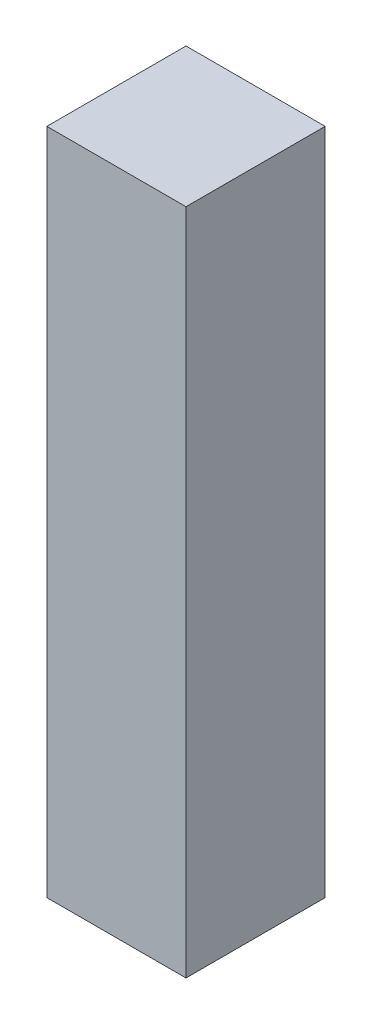
ISO-10303-21;
HEADER;
FILE_DESCRIPTION(('STEP AP214'),'2;1');
FILE_NAME('part.step','',(''),(''),'','','');
FILE_SCHEMA(('AUTOMOTIVE_DESIGN { 1 0 10303 214 1 1 1 1 }'));
ENDSEC;
DATA;
#1=APPLICATION_CONTEXT('core data for automotive mechanical design processes');
#2=APPLICATION_PROTOCOL_DEFINITION('international standard','automotive_design',2000,#1);
#3=PRODUCT_CONTEXT('',#1,'mechanical');
#4=PRODUCT('Part','Part','',(#3));
#5=PRODUCT_RELATED_PRODUCT_CATEGORY('part','',(#4));
#6=PRODUCT_DEFINITION_FORMATION('','',#4);
#7=PRODUCT_DEFINITION_CONTEXT('part definition',#1,'design');
#8=PRODUCT_DEFINITION('design','',#6,#7);
#9=PRODUCT_DEFINITION_SHAPE('','',#8);
#10=(LENGTH_UNIT() NAMED_UNIT(*) SI_UNIT(.MILLI.,.METRE.));
#11=(NAMED_UNIT(*) PLANE_ANGLE_UNIT() SI_UNIT($,.RADIAN.));
#12=(NAMED_UNIT(*) SI_UNIT($,.STERADIAN.) SOLID_ANGLE_UNIT());
#13=UNCERTAINTY_MEASURE_WITH_UNIT(LENGTH_MEASURE(1.E-05),#10,'distance_accuracy_value','');
#14=(GEOMETRIC_REPRESENTATION_CONTEXT(3) GLOBAL_UNCERTAINTY_ASSIGNED_CONTEXT((#13)) GLOBAL_UNIT_ASSIGNED_CONTEXT((#10,
#11,#12)) REPRESENTATION_CONTEXT('',''));
#15=CARTESIAN_POINT('',(0.,0.,0.));
#16=DIRECTION('',(0.,0.,1.));
#17=DIRECTION('',(1.,0.,0.));
#18=AXIS2_PLACEMENT_3D('',#15,#16,#17);
#19=CARTESIAN_POINT('',(330.,508.,-420.));
#20=DIRECTION('',(-1.,0.,0.));
#21=DIRECTION('',(0.,0.,1.));
#22=AXIS2_PLACEMENT_3D('',#19,#20,#21);
#23=PLANE('',#22);
#24=DIRECTION('',(0.,-1.,0.));
#25=VECTOR('',#24,1.);
#26=CARTESIAN_POINT('',(330.,508.,-380.));
#27=LINE('',#26,#25);
#28=CARTESIAN_POINT('',(330.,700.,-380.));
#29=VERTEX_POINT('',#28);
#30=CARTESIAN_POINT('',(330.,508.,-380.));
#31=VERTEX_POINT('',#30);
#32=EDGE_CURVE('E103',#29,#31,#27,.T.);
#33=ORIENTED_EDGE('',*,*,#32,.F.);
#34=DIRECTION('',(0.,0.,1.));
#35=VECTOR('',#34,1.);
#36=CARTESIAN_POINT('',(330.,700.,-420.));
#37=LINE('',#36,#35);
#38=CARTESIAN_POINT('',(330.,700.,-420.));
#39=VERTEX_POINT('',#38);
#40=EDGE_CURVE('E11',#39,#29,#37,.T.);
#41=ORIENTED_EDGE('',*,*,#40,.F.);
#42=DIRECTION('',(0.,-1.,0.));
#43=VECTOR('',#42,1.);
#44=CARTESIAN_POINT('',(330.,508.,-420.));
#45=LINE('',#44,#43);
#46=CARTESIAN_POINT('',(330.,508.,-420.));
#47=VERTEX_POINT('',#46);
#48=EDGE_CURVE('E97',#39,#47,#45,.T.);
#49=ORIENTED_EDGE('',*,*,#48,.T.);
#50=DIRECTION('',(0.,0.,1.));
#51=VECTOR('',#50,1.);
#52=CARTESIAN_POINT('',(330.,508.,-420.));
#53=LINE('',#52,#51);
#54=EDGE_CURVE('E42',#47,#31,#53,.T.);
#55=ORIENTED_EDGE('',*,*,#54,.T.);
#56=EDGE_LOOP('',(#33,#41,#49,#55));
#57=FACE_BOUND('',#56,.T.);
#58=ADVANCED_FACE('F39',(#57),#23,.T.);
#59=CARTESIAN_POINT('',(330.,700.,-420.));
#60=DIRECTION('',(0.,1.,0.));
#61=DIRECTION('',(0.,0.,1.));
#62=AXIS2_PLACEMENT_3D('',#59,#60,#61);
#63=PLANE('',#62);
#64=DIRECTION('',(-1.,0.,0.));
#65=VECTOR('',#64,1.);
#66=CARTESIAN_POINT('',(330.,700.,-380.));
#67=LINE('',#66,#65);
#68=CARTESIAN_POINT('',(370.,700.,-380.));
#69=VERTEX_POINT('',#68);
#70=EDGE_CURVE('E99',#69,#29,#67,.T.);
#71=ORIENTED_EDGE('',*,*,#70,.F.);
#72=DIRECTION('',(0.,0.,1.));
#73=VECTOR('',#72,1.);
#74=CARTESIAN_POINT('',(370.,700.,-420.));
#75=LINE('',#74,#73);
#76=CARTESIAN_POINT('',(370.,700.,-420.));
#77=VERTEX_POINT('',#76);
#78=EDGE_CURVE('E48',#77,#69,#75,.T.);
#79=ORIENTED_EDGE('',*,*,#78,.F.);
#80=DIRECTION('',(-1.,0.,0.));
#81=VECTOR('',#80,1.);
#82=CARTESIAN_POINT('',(330.,700.,-420.));
#83=LINE('',#82,#81);
#84=EDGE_CURVE('E94',#77,#39,#83,.T.);
#85=ORIENTED_EDGE('',*,*,#84,.T.);
#86=ORIENTED_EDGE('',*,*,#40,.T.);
#87=EDGE_LOOP('',(#71,#79,#85,#86));
#88=FACE_BOUND('',#87,.T.);
#89=ADVANCED_FACE('F113',(#88),#63,.T.);
#90=CARTESIAN_POINT('',(370.,508.,-420.));
#91=DIRECTION('',(1.,0.,0.));
#92=DIRECTION('',(0.,0.,-1.));
#93=AXIS2_PLACEMENT_3D('',#90,#91,#92);
#94=PLANE('',#93);
#95=DIRECTION('',(0.,1.,0.));
#96=VECTOR('',#95,1.);
#97=CARTESIAN_POINT('',(370.,508.,-380.));
#98=LINE('',#97,#96);
#99=CARTESIAN_POINT('',(370.,508.,-380.));
#100=VERTEX_POINT('',#99);
#101=EDGE_CURVE('E89',#100,#69,#98,.T.);
#102=ORIENTED_EDGE('',*,*,#101,.F.);
#103=DIRECTION('',(0.,0.,1.));
#104=VECTOR('',#103,1.);
#105=CARTESIAN_POINT('',(370.,508.,-420.));
#106=LINE('',#105,#104);
#107=CARTESIAN_POINT('',(370.,508.,-420.));
#108=VERTEX_POINT('',#107);
#109=EDGE_CURVE('E84',#108,#100,#106,.T.);
#110=ORIENTED_EDGE('',*,*,#109,.F.);
#111=DIRECTION('',(0.,1.,0.));
#112=VECTOR('',#111,1.);
#113=CARTESIAN_POINT('',(370.,508.,-420.));
#114=LINE('',#113,#112);
#115=EDGE_CURVE('E87',#108,#77,#114,.T.);
#116=ORIENTED_EDGE('',*,*,#115,.T.);
#117=ORIENTED_EDGE('',*,*,#78,.T.);
#118=EDGE_LOOP('',(#102,#110,#116,#117));
#119=FACE_BOUND('',#118,.T.);
#120=ADVANCED_FACE('F86',(#119),#94,.T.);
#121=CARTESIAN_POINT('',(330.,508.,-420.));
#122=DIRECTION('',(0.,-1.,0.));
#123=DIRECTION('',(0.,0.,-1.));
#124=AXIS2_PLACEMENT_3D('',#121,#122,#123);
#125=PLANE('',#124);
#126=DIRECTION('',(1.,0.,0.));
#127=VECTOR('',#126,1.);
#128=CARTESIAN_POINT('',(330.,508.,-380.));
#129=LINE('',#128,#127);
#130=EDGE_CURVE('E106',#31,#100,#129,.T.);
#131=ORIENTED_EDGE('',*,*,#130,.F.);
#132=ORIENTED_EDGE('',*,*,#54,.F.);
#133=DIRECTION('',(1.,0.,0.));
#134=VECTOR('',#133,1.);
#135=CARTESIAN_POINT('',(330.,508.,-420.));
#136=LINE('',#135,#134);
#137=EDGE_CURVE('E93',#47,#108,#136,.T.);
#138=ORIENTED_EDGE('',*,*,#137,.T.);
#139=ORIENTED_EDGE('',*,*,#109,.T.);
#140=EDGE_LOOP('',(#131,#132,#138,#139));
#141=FACE_BOUND('',#140,.T.);
#142=ADVANCED_FACE('F96',(#141),#125,.T.);
#143=CARTESIAN_POINT('',(0.,0.,-420.));
#144=DIRECTION('',(0.,0.,-1.));
#145=DIRECTION('',(-1.,0.,0.));
#146=AXIS2_PLACEMENT_3D('',#143,#144,#145);
#147=PLANE('',#146);
#148=ORIENTED_EDGE('',*,*,#48,.F.);
#149=ORIENTED_EDGE('',*,*,#84,.F.);
#150=ORIENTED_EDGE('',*,*,#115,.F.);
#151=ORIENTED_EDGE('',*,*,#137,.F.);
#152=EDGE_LOOP('',(#148,#149,#150,#151));
#153=FACE_BOUND('',#152,.T.);
#154=ADVANCED_FACE('F92',(#153),#147,.T.);
#155=CARTESIAN_POINT('',(0.,0.,-380.));
#156=DIRECTION('',(0.,0.,-1.));
#157=DIRECTION('',(-1.,0.,0.));
#158=AXIS2_PLACEMENT_3D('',#155,#156,#157);
#159=PLANE('',#158);
#160=ORIENTED_EDGE('',*,*,#32,.T.);
#161=ORIENTED_EDGE('',*,*,#130,.T.);
#162=ORIENTED_EDGE('',*,*,#101,.T.);
#163=ORIENTED_EDGE('',*,*,#70,.T.);
#164=EDGE_LOOP('',(#160,#161,#162,#163));
#165=FACE_BOUND('',#164,.T.);
#166=ADVANCED_FACE('F112',(#165),#159,.F.);
#167=CLOSED_SHELL('',(#58,#89,#120,#142,#154,#166));
#168=MANIFOLD_SOLID_BREP('B2',#167);
#169=ADVANCED_BREP_SHAPE_REPRESENTATION('',(#18,#168),#14);
#170=SHAPE_DEFINITION_REPRESENTATION(#9,#169);
ENDSEC;
END-ISO-10303-21;
